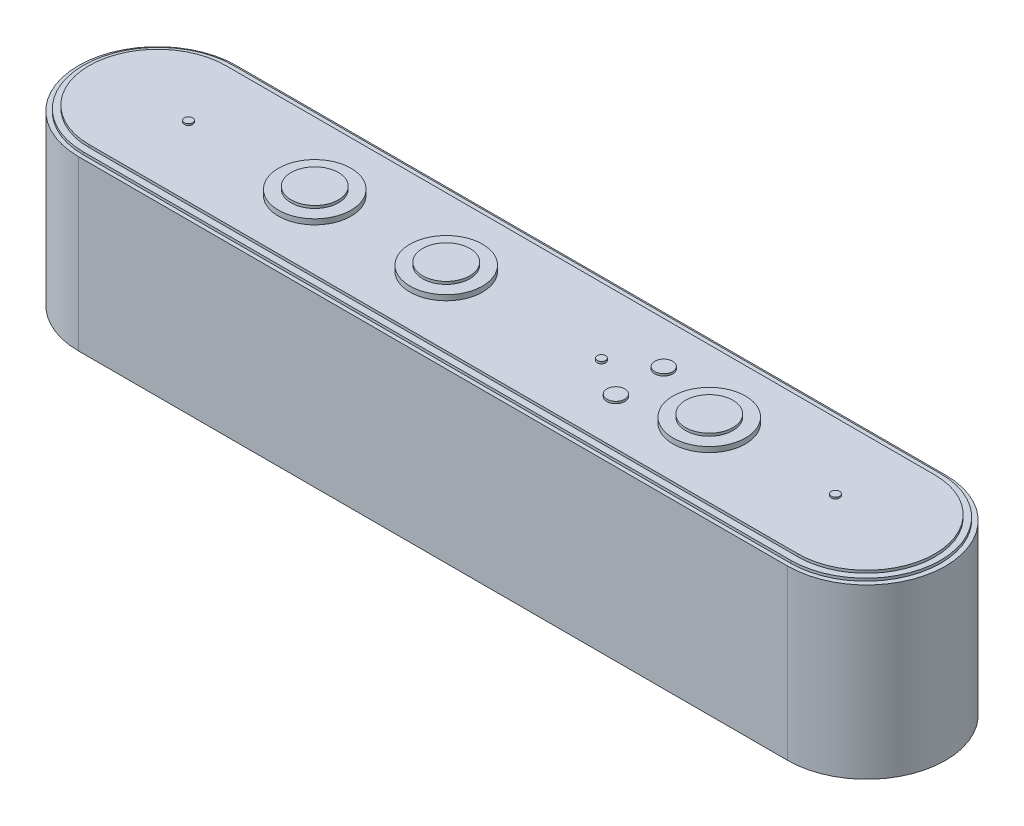
ISO-10303-21;
HEADER;
FILE_DESCRIPTION(('STEP AP214'),'2;1');
FILE_NAME('part.step','',(''),(''),'','','');
FILE_SCHEMA(('AUTOMOTIVE_DESIGN { 1 0 10303 214 1 1 1 1 }'));
ENDSEC;
DATA;
#1=APPLICATION_CONTEXT('core data for automotive mechanical design processes');
#2=APPLICATION_PROTOCOL_DEFINITION('international standard','automotive_design',2000,#1);
#3=PRODUCT_CONTEXT('',#1,'mechanical');
#4=PRODUCT('Part','Part','',(#3));
#5=PRODUCT_RELATED_PRODUCT_CATEGORY('part','',(#4));
#6=PRODUCT_DEFINITION_FORMATION('','',#4);
#7=PRODUCT_DEFINITION_CONTEXT('part definition',#1,'design');
#8=PRODUCT_DEFINITION('design','',#6,#7);
#9=PRODUCT_DEFINITION_SHAPE('','',#8);
#10=(LENGTH_UNIT() NAMED_UNIT(*) SI_UNIT(.MILLI.,.METRE.));
#11=(NAMED_UNIT(*) PLANE_ANGLE_UNIT() SI_UNIT($,.RADIAN.));
#12=(NAMED_UNIT(*) SI_UNIT($,.STERADIAN.) SOLID_ANGLE_UNIT());
#13=UNCERTAINTY_MEASURE_WITH_UNIT(LENGTH_MEASURE(1.E-05),#10,'distance_accuracy_value','');
#14=(GEOMETRIC_REPRESENTATION_CONTEXT(3) GLOBAL_UNCERTAINTY_ASSIGNED_CONTEXT((#13)) GLOBAL_UNIT_ASSIGNED_CONTEXT((#10,
#11,#12)) REPRESENTATION_CONTEXT('',''));
#15=CARTESIAN_POINT('',(0.,0.,0.));
#16=DIRECTION('',(0.,0.,1.));
#17=DIRECTION('',(1.,0.,0.));
#18=AXIS2_PLACEMENT_3D('',#15,#16,#17);
#19=CARTESIAN_POINT('',(0.,14.7,15.));
#20=DIRECTION('',(0.,-1.,0.));
#21=DIRECTION('',(-1.,0.,0.));
#22=AXIS2_PLACEMENT_3D('',#19,#20,#21);
#23=PLANE('',#22);
#24=CARTESIAN_POINT('',(67.425,14.7,15.));
#25=DIRECTION('',(0.,-1.,0.));
#26=DIRECTION('',(0.,0.,-1.));
#27=AXIS2_PLACEMENT_3D('',#24,#25,#26);
#28=CIRCLE('',#27,15.);
#29=CARTESIAN_POINT('',(67.425,14.7,0.));
#30=VERTEX_POINT('',#29);
#31=CARTESIAN_POINT('',(67.425,14.7,30.));
#32=VERTEX_POINT('',#31);
#33=EDGE_CURVE('P0_E25',#30,#32,#28,.T.);
#34=ORIENTED_EDGE('',*,*,#33,.F.);
#35=DIRECTION('',(1.,0.,0.));
#36=VECTOR('',#35,1.);
#37=CARTESIAN_POINT('',(-67.425,14.7,0.));
#38=LINE('',#37,#36);
#39=CARTESIAN_POINT('',(-67.425,14.7,0.));
#40=VERTEX_POINT('',#39);
#41=EDGE_CURVE('P0_E64',#40,#30,#38,.T.);
#42=ORIENTED_EDGE('',*,*,#41,.F.);
#43=CARTESIAN_POINT('',(-67.425,14.7,15.));
#44=DIRECTION('',(0.,-1.,0.));
#45=DIRECTION('',(0.,0.,1.));
#46=AXIS2_PLACEMENT_3D('',#43,#44,#45);
#47=CIRCLE('',#46,15.);
#48=CARTESIAN_POINT('',(-67.425,14.7,30.));
#49=VERTEX_POINT('',#48);
#50=EDGE_CURVE('P0_E67',#49,#40,#47,.T.);
#51=ORIENTED_EDGE('',*,*,#50,.F.);
#52=DIRECTION('',(-1.,0.,0.));
#53=VECTOR('',#52,1.);
#54=CARTESIAN_POINT('',(67.425,14.7,30.));
#55=LINE('',#54,#53);
#56=EDGE_CURVE('P0_E106',#32,#49,#55,.T.);
#57=ORIENTED_EDGE('',*,*,#56,.F.);
#58=EDGE_LOOP('',(#34,#42,#51,#57));
#59=FACE_BOUND('',#58,.T.);
#60=ADVANCED_FACE('P0_F17',(#59),#23,.F.);
#61=CARTESIAN_POINT('',(0.,-17.3,15.));
#62=DIRECTION('',(0.,-1.,0.));
#63=DIRECTION('',(-1.,0.,0.));
#64=AXIS2_PLACEMENT_3D('',#61,#62,#63);
#65=PLANE('',#64);
#66=DIRECTION('',(-1.,0.,0.));
#67=VECTOR('',#66,1.);
#68=CARTESIAN_POINT('',(67.425,-17.3,30.));
#69=LINE('',#68,#67);
#70=CARTESIAN_POINT('',(67.425,-17.3,30.));
#71=VERTEX_POINT('',#70);
#72=CARTESIAN_POINT('',(-67.425,-17.3,30.));
#73=VERTEX_POINT('',#72);
#74=EDGE_CURVE('P0_E88',#71,#73,#69,.T.);
#75=ORIENTED_EDGE('',*,*,#74,.T.);
#76=CARTESIAN_POINT('',(-67.425,-17.3,15.));
#77=DIRECTION('',(0.,-1.,0.));
#78=DIRECTION('',(0.,0.,1.));
#79=AXIS2_PLACEMENT_3D('',#76,#77,#78);
#80=CIRCLE('',#79,15.);
#81=CARTESIAN_POINT('',(-67.425,-17.3,0.));
#82=VERTEX_POINT('',#81);
#83=EDGE_CURVE('P0_E73',#73,#82,#80,.T.);
#84=ORIENTED_EDGE('',*,*,#83,.T.);
#85=DIRECTION('',(1.,0.,0.));
#86=VECTOR('',#85,1.);
#87=CARTESIAN_POINT('',(-67.425,-17.3,0.));
#88=LINE('',#87,#86);
#89=CARTESIAN_POINT('',(67.425,-17.3,0.));
#90=VERTEX_POINT('',#89);
#91=EDGE_CURVE('P0_E78',#82,#90,#88,.T.);
#92=ORIENTED_EDGE('',*,*,#91,.T.);
#93=CARTESIAN_POINT('',(67.425,-17.3,15.));
#94=DIRECTION('',(0.,-1.,0.));
#95=DIRECTION('',(0.,0.,-1.));
#96=AXIS2_PLACEMENT_3D('',#93,#94,#95);
#97=CIRCLE('',#96,15.);
#98=EDGE_CURVE('P0_E11',#90,#71,#97,.T.);
#99=ORIENTED_EDGE('',*,*,#98,.T.);
#100=EDGE_LOOP('',(#75,#84,#92,#99));
#101=FACE_BOUND('',#100,.T.);
#102=ADVANCED_FACE('P0_F125',(#101),#65,.T.);
#103=CARTESIAN_POINT('',(67.425,-17.3,15.));
#104=DIRECTION('',(0.,-1.,0.));
#105=DIRECTION('',(0.,0.,-1.));
#106=AXIS2_PLACEMENT_3D('',#103,#104,#105);
#107=CYLINDRICAL_SURFACE('',#106,15.);
#108=DIRECTION('',(0.,1.,0.));
#109=VECTOR('',#108,1.);
#110=CARTESIAN_POINT('',(67.425,-17.3,0.));
#111=LINE('',#110,#109);
#112=EDGE_CURVE('P0_E72',#90,#30,#111,.T.);
#113=ORIENTED_EDGE('',*,*,#112,.T.);
#114=ORIENTED_EDGE('',*,*,#33,.T.);
#115=DIRECTION('',(0.,1.,0.));
#116=VECTOR('',#115,1.);
#117=CARTESIAN_POINT('',(67.425,-17.3,30.));
#118=LINE('',#117,#116);
#119=EDGE_CURVE('P0_E105',#71,#32,#118,.T.);
#120=ORIENTED_EDGE('',*,*,#119,.F.);
#121=ORIENTED_EDGE('',*,*,#98,.F.);
#122=EDGE_LOOP('',(#113,#114,#120,#121));
#123=FACE_BOUND('',#122,.T.);
#124=ADVANCED_FACE('P0_F102',(#123),#107,.T.);
#125=CARTESIAN_POINT('',(-67.425,-17.3,0.));
#126=DIRECTION('',(0.,0.,-1.));
#127=DIRECTION('',(0.,-1.,0.));
#128=AXIS2_PLACEMENT_3D('',#125,#126,#127);
#129=PLANE('',#128);
#130=DIRECTION('',(0.,1.,0.));
#131=VECTOR('',#130,1.);
#132=CARTESIAN_POINT('',(-67.425,-17.3,0.));
#133=LINE('',#132,#131);
#134=EDGE_CURVE('P0_E76',#82,#40,#133,.T.);
#135=ORIENTED_EDGE('',*,*,#134,.T.);
#136=ORIENTED_EDGE('',*,*,#41,.T.);
#137=ORIENTED_EDGE('',*,*,#112,.F.);
#138=ORIENTED_EDGE('',*,*,#91,.F.);
#139=EDGE_LOOP('',(#135,#136,#137,#138));
#140=FACE_BOUND('',#139,.T.);
#141=ADVANCED_FACE('P0_F77',(#140),#129,.T.);
#142=CARTESIAN_POINT('',(-67.425,-17.3,15.));
#143=DIRECTION('',(0.,-1.,0.));
#144=DIRECTION('',(0.,0.,1.));
#145=AXIS2_PLACEMENT_3D('',#142,#143,#144);
#146=CYLINDRICAL_SURFACE('',#145,15.);
#147=DIRECTION('',(0.,1.,0.));
#148=VECTOR('',#147,1.);
#149=CARTESIAN_POINT('',(-67.425,-17.3,30.));
#150=LINE('',#149,#148);
#151=EDGE_CURVE('P0_E85',#73,#49,#150,.T.);
#152=ORIENTED_EDGE('',*,*,#151,.T.);
#153=ORIENTED_EDGE('',*,*,#50,.T.);
#154=ORIENTED_EDGE('',*,*,#134,.F.);
#155=ORIENTED_EDGE('',*,*,#83,.F.);
#156=EDGE_LOOP('',(#152,#153,#154,#155));
#157=FACE_BOUND('',#156,.T.);
#158=ADVANCED_FACE('P0_F83',(#157),#146,.T.);
#159=CARTESIAN_POINT('',(67.425,-17.3,30.));
#160=DIRECTION('',(0.,0.,1.));
#161=DIRECTION('',(1.,0.,0.));
#162=AXIS2_PLACEMENT_3D('',#159,#160,#161);
#163=PLANE('',#162);
#164=ORIENTED_EDGE('',*,*,#119,.T.);
#165=ORIENTED_EDGE('',*,*,#56,.T.);
#166=ORIENTED_EDGE('',*,*,#151,.F.);
#167=ORIENTED_EDGE('',*,*,#74,.F.);
#168=EDGE_LOOP('',(#164,#165,#166,#167));
#169=FACE_BOUND('',#168,.T.);
#170=ADVANCED_FACE('P0_F111',(#169),#163,.T.);
#171=CLOSED_SHELL('',(#60,#102,#124,#141,#158,#170));
#172=MANIFOLD_SOLID_BREP('P0_B1',#171);
#173=CARTESIAN_POINT('',(61.5,15.85,15.));
#174=DIRECTION('',(0.,1.,0.));
#175=DIRECTION('',(1.,0.,0.));
#176=AXIS2_PLACEMENT_3D('',#173,#174,#175);
#177=PLANE('',#176);
#178=CARTESIAN_POINT('',(61.5,15.85,15.));
#179=DIRECTION('',(0.,1.,0.));
#180=DIRECTION('',(0.,0.,-1.));
#181=AXIS2_PLACEMENT_3D('',#178,#179,#180);
#182=CIRCLE('',#181,0.8);
#183=CARTESIAN_POINT('',(61.5,15.85,14.2));
#184=VERTEX_POINT('',#183);
#185=EDGE_CURVE('P1_E11',#184,#184,#182,.T.);
#186=ORIENTED_EDGE('',*,*,#185,.F.);
#187=EDGE_LOOP('',(#186));
#188=FACE_BOUND('',#187,.T.);
#189=ADVANCED_FACE('P1_F17',(#188),#177,.F.);
#190=CARTESIAN_POINT('',(61.5,16.15,15.));
#191=DIRECTION('',(0.,1.,0.));
#192=DIRECTION('',(1.,0.,0.));
#193=AXIS2_PLACEMENT_3D('',#190,#191,#192);
#194=PLANE('',#193);
#195=CARTESIAN_POINT('',(61.5,16.15,15.));
#196=DIRECTION('',(0.,1.,0.));
#197=DIRECTION('',(0.,0.,-1.));
#198=AXIS2_PLACEMENT_3D('',#195,#196,#197);
#199=CIRCLE('',#198,0.8);
#200=CARTESIAN_POINT('',(61.5,16.15,14.2));
#201=VERTEX_POINT('',#200);
#202=EDGE_CURVE('P1_E41',#201,#201,#199,.T.);
#203=ORIENTED_EDGE('',*,*,#202,.T.);
#204=EDGE_LOOP('',(#203));
#205=FACE_BOUND('',#204,.T.);
#206=ADVANCED_FACE('P1_F44',(#205),#194,.T.);
#207=CARTESIAN_POINT('',(61.5,15.85,15.));
#208=DIRECTION('',(0.,1.,0.));
#209=DIRECTION('',(0.,0.,-1.));
#210=AXIS2_PLACEMENT_3D('',#207,#208,#209);
#211=CYLINDRICAL_SURFACE('',#210,0.8);
#212=ORIENTED_EDGE('',*,*,#202,.F.);
#213=DIRECTION('',(0.,1.,0.));
#214=VECTOR('',#213,1.);
#215=CARTESIAN_POINT('',(61.5,15.85,14.2));
#216=LINE('',#215,#214);
#217=EDGE_CURVE('P1_E25',#184,#201,#216,.T.);
#218=ORIENTED_EDGE('',*,*,#217,.F.);
#219=ORIENTED_EDGE('',*,*,#185,.T.);
#220=ORIENTED_EDGE('',*,*,#217,.T.);
#221=EDGE_LOOP('',(#212,#218,#219,#220));
#222=FACE_BOUND('',#221,.T.);
#223=ADVANCED_FACE('P1_F40',(#222),#211,.T.);
#224=CLOSED_SHELL('',(#189,#206,#223));
#225=MANIFOLD_SOLID_BREP('P1_B1',#224);
#226=CARTESIAN_POINT('',(-61.5,15.85,15.));
#227=DIRECTION('',(0.,1.,0.));
#228=DIRECTION('',(1.,0.,0.));
#229=AXIS2_PLACEMENT_3D('',#226,#227,#228);
#230=PLANE('',#229);
#231=CARTESIAN_POINT('',(-61.5,15.85,15.));
#232=DIRECTION('',(0.,1.,0.));
#233=DIRECTION('',(0.,0.,-1.));
#234=AXIS2_PLACEMENT_3D('',#231,#232,#233);
#235=CIRCLE('',#234,0.8);
#236=CARTESIAN_POINT('',(-61.5,15.85,14.2));
#237=VERTEX_POINT('',#236);
#238=EDGE_CURVE('P2_E11',#237,#237,#235,.T.);
#239=ORIENTED_EDGE('',*,*,#238,.F.);
#240=EDGE_LOOP('',(#239));
#241=FACE_BOUND('',#240,.T.);
#242=ADVANCED_FACE('P2_F17',(#241),#230,.F.);
#243=CARTESIAN_POINT('',(-61.5,16.15,15.));
#244=DIRECTION('',(0.,1.,0.));
#245=DIRECTION('',(1.,0.,0.));
#246=AXIS2_PLACEMENT_3D('',#243,#244,#245);
#247=PLANE('',#246);
#248=CARTESIAN_POINT('',(-61.5,16.15,15.));
#249=DIRECTION('',(0.,1.,0.));
#250=DIRECTION('',(0.,0.,-1.));
#251=AXIS2_PLACEMENT_3D('',#248,#249,#250);
#252=CIRCLE('',#251,0.8);
#253=CARTESIAN_POINT('',(-61.5,16.15,14.2));
#254=VERTEX_POINT('',#253);
#255=EDGE_CURVE('P2_E41',#254,#254,#252,.T.);
#256=ORIENTED_EDGE('',*,*,#255,.T.);
#257=EDGE_LOOP('',(#256));
#258=FACE_BOUND('',#257,.T.);
#259=ADVANCED_FACE('P2_F44',(#258),#247,.T.);
#260=CARTESIAN_POINT('',(-61.5,15.85,15.));
#261=DIRECTION('',(0.,1.,0.));
#262=DIRECTION('',(0.,0.,-1.));
#263=AXIS2_PLACEMENT_3D('',#260,#261,#262);
#264=CYLINDRICAL_SURFACE('',#263,0.8);
#265=ORIENTED_EDGE('',*,*,#255,.F.);
#266=DIRECTION('',(0.,1.,0.));
#267=VECTOR('',#266,1.);
#268=CARTESIAN_POINT('',(-61.5,15.85,14.2));
#269=LINE('',#268,#267);
#270=EDGE_CURVE('P2_E25',#237,#254,#269,.T.);
#271=ORIENTED_EDGE('',*,*,#270,.F.);
#272=ORIENTED_EDGE('',*,*,#238,.T.);
#273=ORIENTED_EDGE('',*,*,#270,.T.);
#274=EDGE_LOOP('',(#265,#271,#272,#273));
#275=FACE_BOUND('',#274,.T.);
#276=ADVANCED_FACE('P2_F40',(#275),#264,.T.);
#277=CLOSED_SHELL('',(#242,#259,#276));
#278=MANIFOLD_SOLID_BREP('P2_B1',#277);
#279=CARTESIAN_POINT('',(24.3,15.85,10.45));
#280=DIRECTION('',(0.,1.,0.));
#281=DIRECTION('',(1.,0.,0.));
#282=AXIS2_PLACEMENT_3D('',#279,#280,#281);
#283=PLANE('',#282);
#284=CARTESIAN_POINT('',(24.3,15.85,10.45));
#285=DIRECTION('',(0.,1.,0.));
#286=DIRECTION('',(0.,0.,-1.));
#287=AXIS2_PLACEMENT_3D('',#284,#285,#286);
#288=CIRCLE('',#287,1.7);
#289=CARTESIAN_POINT('',(24.3,15.85,8.75));
#290=VERTEX_POINT('',#289);
#291=EDGE_CURVE('P3_E11',#290,#290,#288,.T.);
#292=ORIENTED_EDGE('',*,*,#291,.F.);
#293=EDGE_LOOP('',(#292));
#294=FACE_BOUND('',#293,.T.);
#295=ADVANCED_FACE('P3_F17',(#294),#283,.F.);
#296=CARTESIAN_POINT('',(24.3,16.25,10.45));
#297=DIRECTION('',(0.,1.,0.));
#298=DIRECTION('',(1.,0.,0.));
#299=AXIS2_PLACEMENT_3D('',#296,#297,#298);
#300=PLANE('',#299);
#301=CARTESIAN_POINT('',(24.3,16.25,10.45));
#302=DIRECTION('',(0.,1.,0.));
#303=DIRECTION('',(0.,0.,-1.));
#304=AXIS2_PLACEMENT_3D('',#301,#302,#303);
#305=CIRCLE('',#304,1.7);
#306=CARTESIAN_POINT('',(24.3,16.25,8.75));
#307=VERTEX_POINT('',#306);
#308=EDGE_CURVE('P3_E41',#307,#307,#305,.T.);
#309=ORIENTED_EDGE('',*,*,#308,.T.);
#310=EDGE_LOOP('',(#309));
#311=FACE_BOUND('',#310,.T.);
#312=ADVANCED_FACE('P3_F44',(#311),#300,.T.);
#313=CARTESIAN_POINT('',(24.3,15.85,10.45));
#314=DIRECTION('',(0.,1.,0.));
#315=DIRECTION('',(0.,0.,-1.));
#316=AXIS2_PLACEMENT_3D('',#313,#314,#315);
#317=CYLINDRICAL_SURFACE('',#316,1.7);
#318=ORIENTED_EDGE('',*,*,#308,.F.);
#319=DIRECTION('',(0.,1.,0.));
#320=VECTOR('',#319,1.);
#321=CARTESIAN_POINT('',(24.3,15.85,8.75));
#322=LINE('',#321,#320);
#323=EDGE_CURVE('P3_E20',#290,#307,#322,.T.);
#324=ORIENTED_EDGE('',*,*,#323,.F.);
#325=ORIENTED_EDGE('',*,*,#291,.T.);
#326=ORIENTED_EDGE('',*,*,#323,.T.);
#327=EDGE_LOOP('',(#318,#324,#325,#326));
#328=FACE_BOUND('',#327,.T.);
#329=ADVANCED_FACE('P3_F40',(#328),#317,.T.);
#330=CLOSED_SHELL('',(#295,#312,#329));
#331=MANIFOLD_SOLID_BREP('P3_B1',#330);
#332=CARTESIAN_POINT('',(24.3,15.85,19.55));
#333=DIRECTION('',(0.,1.,0.));
#334=DIRECTION('',(1.,0.,0.));
#335=AXIS2_PLACEMENT_3D('',#332,#333,#334);
#336=PLANE('',#335);
#337=CARTESIAN_POINT('',(24.3,15.85,19.55));
#338=DIRECTION('',(0.,1.,0.));
#339=DIRECTION('',(0.,0.,-1.));
#340=AXIS2_PLACEMENT_3D('',#337,#338,#339);
#341=CIRCLE('',#340,1.7);
#342=CARTESIAN_POINT('',(24.3,15.85,17.85));
#343=VERTEX_POINT('',#342);
#344=EDGE_CURVE('P4_E11',#343,#343,#341,.T.);
#345=ORIENTED_EDGE('',*,*,#344,.F.);
#346=EDGE_LOOP('',(#345));
#347=FACE_BOUND('',#346,.T.);
#348=ADVANCED_FACE('P4_F17',(#347),#336,.F.);
#349=CARTESIAN_POINT('',(24.3,16.25,19.55));
#350=DIRECTION('',(0.,1.,0.));
#351=DIRECTION('',(1.,0.,0.));
#352=AXIS2_PLACEMENT_3D('',#349,#350,#351);
#353=PLANE('',#352);
#354=CARTESIAN_POINT('',(24.3,16.25,19.55));
#355=DIRECTION('',(0.,1.,0.));
#356=DIRECTION('',(0.,0.,-1.));
#357=AXIS2_PLACEMENT_3D('',#354,#355,#356);
#358=CIRCLE('',#357,1.7);
#359=CARTESIAN_POINT('',(24.3,16.25,17.85));
#360=VERTEX_POINT('',#359);
#361=EDGE_CURVE('P4_E41',#360,#360,#358,.T.);
#362=ORIENTED_EDGE('',*,*,#361,.T.);
#363=EDGE_LOOP('',(#362));
#364=FACE_BOUND('',#363,.T.);
#365=ADVANCED_FACE('P4_F44',(#364),#353,.T.);
#366=CARTESIAN_POINT('',(24.3,15.85,19.55));
#367=DIRECTION('',(0.,1.,0.));
#368=DIRECTION('',(0.,0.,-1.));
#369=AXIS2_PLACEMENT_3D('',#366,#367,#368);
#370=CYLINDRICAL_SURFACE('',#369,1.7);
#371=ORIENTED_EDGE('',*,*,#361,.F.);
#372=DIRECTION('',(0.,1.,0.));
#373=VECTOR('',#372,1.);
#374=CARTESIAN_POINT('',(24.3,15.85,17.85));
#375=LINE('',#374,#373);
#376=EDGE_CURVE('P4_E25',#343,#360,#375,.T.);
#377=ORIENTED_EDGE('',*,*,#376,.F.);
#378=ORIENTED_EDGE('',*,*,#344,.T.);
#379=ORIENTED_EDGE('',*,*,#376,.T.);
#380=EDGE_LOOP('',(#371,#377,#378,#379));
#381=FACE_BOUND('',#380,.T.);
#382=ADVANCED_FACE('P4_F40',(#381),#370,.T.);
#383=CLOSED_SHELL('',(#348,#365,#382));
#384=MANIFOLD_SOLID_BREP('P4_B1',#383);
#385=CARTESIAN_POINT('',(17.,15.85,15.));
#386=DIRECTION('',(0.,1.,0.));
#387=DIRECTION('',(1.,0.,0.));
#388=AXIS2_PLACEMENT_3D('',#385,#386,#387);
#389=PLANE('',#388);
#390=CARTESIAN_POINT('',(17.,15.85,15.));
#391=DIRECTION('',(0.,1.,0.));
#392=DIRECTION('',(0.,0.,-1.));
#393=AXIS2_PLACEMENT_3D('',#390,#391,#392);
#394=CIRCLE('',#393,0.8);
#395=CARTESIAN_POINT('',(17.,15.85,14.2));
#396=VERTEX_POINT('',#395);
#397=EDGE_CURVE('P5_E10',#396,#396,#394,.T.);
#398=ORIENTED_EDGE('',*,*,#397,.F.);
#399=EDGE_LOOP('',(#398));
#400=FACE_BOUND('',#399,.T.);
#401=ADVANCED_FACE('P5_F16',(#400),#389,.F.);
#402=CARTESIAN_POINT('',(17.,16.25,15.));
#403=DIRECTION('',(0.,1.,0.));
#404=DIRECTION('',(1.,0.,0.));
#405=AXIS2_PLACEMENT_3D('',#402,#403,#404);
#406=PLANE('',#405);
#407=CARTESIAN_POINT('',(17.,16.25,15.));
#408=DIRECTION('',(0.,1.,0.));
#409=DIRECTION('',(0.,0.,-1.));
#410=AXIS2_PLACEMENT_3D('',#407,#408,#409);
#411=CIRCLE('',#410,0.8);
#412=CARTESIAN_POINT('',(17.,16.25,14.2));
#413=VERTEX_POINT('',#412);
#414=EDGE_CURVE('P5_E40',#413,#413,#411,.T.);
#415=ORIENTED_EDGE('',*,*,#414,.T.);
#416=EDGE_LOOP('',(#415));
#417=FACE_BOUND('',#416,.T.);
#418=ADVANCED_FACE('P5_F43',(#417),#406,.T.);
#419=CARTESIAN_POINT('',(17.,15.85,15.));
#420=DIRECTION('',(0.,1.,0.));
#421=DIRECTION('',(0.,0.,-1.));
#422=AXIS2_PLACEMENT_3D('',#419,#420,#421);
#423=CYLINDRICAL_SURFACE('',#422,0.8);
#424=ORIENTED_EDGE('',*,*,#414,.F.);
#425=DIRECTION('',(0.,1.,0.));
#426=VECTOR('',#425,1.);
#427=CARTESIAN_POINT('',(17.,15.85,14.2));
#428=LINE('',#427,#426);
#429=EDGE_CURVE('P5_E19',#396,#413,#428,.T.);
#430=ORIENTED_EDGE('',*,*,#429,.F.);
#431=ORIENTED_EDGE('',*,*,#397,.T.);
#432=ORIENTED_EDGE('',*,*,#429,.T.);
#433=EDGE_LOOP('',(#424,#430,#431,#432));
#434=FACE_BOUND('',#433,.T.);
#435=ADVANCED_FACE('P5_F39',(#434),#423,.T.);
#436=CLOSED_SHELL('',(#401,#418,#435));
#437=MANIFOLD_SOLID_BREP('P5_B1',#436);
#438=CARTESIAN_POINT('',(0.,15.7,15.));
#439=DIRECTION('',(0.,-1.,0.));
#440=DIRECTION('',(-1.,0.,0.));
#441=AXIS2_PLACEMENT_3D('',#438,#439,#440);
#442=PLANE('',#441);
#443=CARTESIAN_POINT('',(67.4,15.7,15.));
#444=DIRECTION('',(0.,-1.,0.));
#445=DIRECTION('',(0.,0.,-1.));
#446=AXIS2_PLACEMENT_3D('',#443,#444,#445);
#447=CIRCLE('',#446,13.);
#448=CARTESIAN_POINT('',(67.4,15.7,2.));
#449=VERTEX_POINT('',#448);
#450=CARTESIAN_POINT('',(67.4,15.7,28.));
#451=VERTEX_POINT('',#450);
#452=EDGE_CURVE('P6_E26',#449,#451,#447,.T.);
#453=ORIENTED_EDGE('',*,*,#452,.F.);
#454=DIRECTION('',(1.,0.,0.));
#455=VECTOR('',#454,1.);
#456=CARTESIAN_POINT('',(-67.4,15.7,2.));
#457=LINE('',#456,#455);
#458=CARTESIAN_POINT('',(-67.4,15.7,2.));
#459=VERTEX_POINT('',#458);
#460=EDGE_CURVE('P6_E107',#459,#449,#457,.T.);
#461=ORIENTED_EDGE('',*,*,#460,.F.);
#462=CARTESIAN_POINT('',(-67.4,15.7,15.));
#463=DIRECTION('',(0.,-1.,0.));
#464=DIRECTION('',(0.,0.,1.));
#465=AXIS2_PLACEMENT_3D('',#462,#463,#464);
#466=CIRCLE('',#465,13.);
#467=CARTESIAN_POINT('',(-67.4,15.7,28.));
#468=VERTEX_POINT('',#467);
#469=EDGE_CURVE('P6_E83',#468,#459,#466,.T.);
#470=ORIENTED_EDGE('',*,*,#469,.F.);
#471=DIRECTION('',(-1.,0.,0.));
#472=VECTOR('',#471,1.);
#473=CARTESIAN_POINT('',(67.4,15.7,28.));
#474=LINE('',#473,#472);
#475=EDGE_CURVE('P6_E87',#451,#468,#474,.T.);
#476=ORIENTED_EDGE('',*,*,#475,.F.);
#477=EDGE_LOOP('',(#453,#461,#470,#476));
#478=FACE_BOUND('',#477,.T.);
#479=ADVANCED_FACE('P6_F17',(#478),#442,.F.);
#480=CARTESIAN_POINT('',(0.,14.7,15.));
#481=DIRECTION('',(0.,-1.,0.));
#482=DIRECTION('',(-1.,0.,0.));
#483=AXIS2_PLACEMENT_3D('',#480,#481,#482);
#484=PLANE('',#483);
#485=DIRECTION('',(-1.,0.,0.));
#486=VECTOR('',#485,1.);
#487=CARTESIAN_POINT('',(67.4,14.7,28.));
#488=LINE('',#487,#486);
#489=CARTESIAN_POINT('',(67.4,14.7,28.));
#490=VERTEX_POINT('',#489);
#491=CARTESIAN_POINT('',(-67.4,14.7,28.));
#492=VERTEX_POINT('',#491);
#493=EDGE_CURVE('P6_E72',#490,#492,#488,.T.);
#494=ORIENTED_EDGE('',*,*,#493,.T.);
#495=CARTESIAN_POINT('',(-67.4,14.7,15.));
#496=DIRECTION('',(0.,-1.,0.));
#497=DIRECTION('',(0.,0.,1.));
#498=AXIS2_PLACEMENT_3D('',#495,#496,#497);
#499=CIRCLE('',#498,13.);
#500=CARTESIAN_POINT('',(-67.4,14.7,2.));
#501=VERTEX_POINT('',#500);
#502=EDGE_CURVE('P6_E99',#492,#501,#499,.T.);
#503=ORIENTED_EDGE('',*,*,#502,.T.);
#504=DIRECTION('',(1.,0.,0.));
#505=VECTOR('',#504,1.);
#506=CARTESIAN_POINT('',(-67.4,14.7,2.));
#507=LINE('',#506,#505);
#508=CARTESIAN_POINT('',(67.4,14.7,2.));
#509=VERTEX_POINT('',#508);
#510=EDGE_CURVE('P6_E20',#501,#509,#507,.T.);
#511=ORIENTED_EDGE('',*,*,#510,.T.);
#512=CARTESIAN_POINT('',(67.4,14.7,15.));
#513=DIRECTION('',(0.,-1.,0.));
#514=DIRECTION('',(0.,0.,-1.));
#515=AXIS2_PLACEMENT_3D('',#512,#513,#514);
#516=CIRCLE('',#515,13.);
#517=EDGE_CURVE('P6_E11',#509,#490,#516,.T.);
#518=ORIENTED_EDGE('',*,*,#517,.T.);
#519=EDGE_LOOP('',(#494,#503,#511,#518));
#520=FACE_BOUND('',#519,.T.);
#521=ADVANCED_FACE('P6_F70',(#520),#484,.T.);
#522=CARTESIAN_POINT('',(67.4,14.7,15.));
#523=DIRECTION('',(0.,-1.,0.));
#524=DIRECTION('',(0.,0.,-1.));
#525=AXIS2_PLACEMENT_3D('',#522,#523,#524);
#526=CYLINDRICAL_SURFACE('',#525,13.);
#527=DIRECTION('',(0.,1.,0.));
#528=VECTOR('',#527,1.);
#529=CARTESIAN_POINT('',(67.4,14.7,2.));
#530=LINE('',#529,#528);
#531=EDGE_CURVE('P6_E111',#509,#449,#530,.T.);
#532=ORIENTED_EDGE('',*,*,#531,.T.);
#533=ORIENTED_EDGE('',*,*,#452,.T.);
#534=DIRECTION('',(0.,1.,0.));
#535=VECTOR('',#534,1.);
#536=CARTESIAN_POINT('',(67.4,14.7,28.));
#537=LINE('',#536,#535);
#538=EDGE_CURVE('P6_E79',#490,#451,#537,.T.);
#539=ORIENTED_EDGE('',*,*,#538,.F.);
#540=ORIENTED_EDGE('',*,*,#517,.F.);
#541=EDGE_LOOP('',(#532,#533,#539,#540));
#542=FACE_BOUND('',#541,.T.);
#543=ADVANCED_FACE('P6_F85',(#542),#526,.T.);
#544=CARTESIAN_POINT('',(-67.4,14.7,2.));
#545=DIRECTION('',(0.,0.,-1.));
#546=DIRECTION('',(0.,-1.,0.));
#547=AXIS2_PLACEMENT_3D('',#544,#545,#546);
#548=PLANE('',#547);
#549=DIRECTION('',(0.,1.,0.));
#550=VECTOR('',#549,1.);
#551=CARTESIAN_POINT('',(-67.4,14.7,2.));
#552=LINE('',#551,#550);
#553=EDGE_CURVE('P6_E95',#501,#459,#552,.T.);
#554=ORIENTED_EDGE('',*,*,#553,.T.);
#555=ORIENTED_EDGE('',*,*,#460,.T.);
#556=ORIENTED_EDGE('',*,*,#531,.F.);
#557=ORIENTED_EDGE('',*,*,#510,.F.);
#558=EDGE_LOOP('',(#554,#555,#556,#557));
#559=FACE_BOUND('',#558,.T.);
#560=ADVANCED_FACE('P6_F133',(#559),#548,.T.);
#561=CARTESIAN_POINT('',(-67.4,14.7,15.));
#562=DIRECTION('',(0.,-1.,0.));
#563=DIRECTION('',(0.,0.,1.));
#564=AXIS2_PLACEMENT_3D('',#561,#562,#563);
#565=CYLINDRICAL_SURFACE('',#564,13.);
#566=DIRECTION('',(0.,1.,0.));
#567=VECTOR('',#566,1.);
#568=CARTESIAN_POINT('',(-67.4,14.7,28.));
#569=LINE('',#568,#567);
#570=EDGE_CURVE('P6_E81',#492,#468,#569,.T.);
#571=ORIENTED_EDGE('',*,*,#570,.T.);
#572=ORIENTED_EDGE('',*,*,#469,.T.);
#573=ORIENTED_EDGE('',*,*,#553,.F.);
#574=ORIENTED_EDGE('',*,*,#502,.F.);
#575=EDGE_LOOP('',(#571,#572,#573,#574));
#576=FACE_BOUND('',#575,.T.);
#577=ADVANCED_FACE('P6_F124',(#576),#565,.T.);
#578=CARTESIAN_POINT('',(67.4,14.7,28.));
#579=DIRECTION('',(0.,0.,1.));
#580=DIRECTION('',(1.,0.,0.));
#581=AXIS2_PLACEMENT_3D('',#578,#579,#580);
#582=PLANE('',#581);
#583=ORIENTED_EDGE('',*,*,#538,.T.);
#584=ORIENTED_EDGE('',*,*,#475,.T.);
#585=ORIENTED_EDGE('',*,*,#570,.F.);
#586=ORIENTED_EDGE('',*,*,#493,.F.);
#587=EDGE_LOOP('',(#583,#584,#585,#586));
#588=FACE_BOUND('',#587,.T.);
#589=ADVANCED_FACE('P6_F77',(#588),#582,.T.);
#590=CLOSED_SHELL('',(#479,#521,#543,#560,#577,#589));
#591=MANIFOLD_SOLID_BREP('P6_B1',#590);
#592=CARTESIAN_POINT('',(67.4,14.2,15.));
#593=DIRECTION('',(0.,-1.,0.));
#594=DIRECTION('',(0.,0.,-1.));
#595=AXIS2_PLACEMENT_3D('',#592,#593,#594);
#596=CYLINDRICAL_SURFACE('',#595,12.5);
#597=DIRECTION('',(0.,1.,0.));
#598=VECTOR('',#597,1.);
#599=CARTESIAN_POINT('',(67.4,14.2,27.5));
#600=LINE('',#599,#598);
#601=CARTESIAN_POINT('',(67.4,14.7,27.5));
#602=VERTEX_POINT('',#601);
#603=CARTESIAN_POINT('',(67.4,15.2,27.5));
#604=VERTEX_POINT('',#603);
#605=EDGE_CURVE('P7_E39',#602,#604,#600,.T.);
#606=ORIENTED_EDGE('',*,*,#605,.T.);
#607=CARTESIAN_POINT('',(67.4,15.2,15.));
#608=DIRECTION('',(0.,-1.,0.));
#609=DIRECTION('',(0.,0.,-1.));
#610=AXIS2_PLACEMENT_3D('',#607,#608,#609);
#611=CIRCLE('',#610,12.5);
#612=CARTESIAN_POINT('',(67.4,15.2,2.5));
#613=VERTEX_POINT('',#612);
#614=EDGE_CURVE('P7_E160',#613,#604,#611,.T.);
#615=ORIENTED_EDGE('',*,*,#614,.F.);
#616=DIRECTION('',(0.,1.,0.));
#617=VECTOR('',#616,1.);
#618=CARTESIAN_POINT('',(67.4,14.2,2.5));
#619=LINE('',#618,#617);
#620=CARTESIAN_POINT('',(67.4,14.7,2.5));
#621=VERTEX_POINT('',#620);
#622=EDGE_CURVE('P7_E11',#621,#613,#619,.T.);
#623=ORIENTED_EDGE('',*,*,#622,.F.);
#624=CARTESIAN_POINT('',(67.4,14.7,15.));
#625=DIRECTION('',(0.,-1.,0.));
#626=DIRECTION('',(0.,0.,-1.));
#627=AXIS2_PLACEMENT_3D('',#624,#625,#626);
#628=CIRCLE('',#627,12.5);
#629=EDGE_CURVE('P7_E125',#621,#602,#628,.T.);
#630=ORIENTED_EDGE('',*,*,#629,.T.);
#631=EDGE_LOOP('',(#606,#615,#623,#630));
#632=FACE_BOUND('',#631,.T.);
#633=ADVANCED_FACE('P7_F17',(#632),#596,.F.);
#634=CARTESIAN_POINT('',(-67.4,14.2,2.5));
#635=DIRECTION('',(0.,0.,-1.));
#636=DIRECTION('',(0.,-1.,0.));
#637=AXIS2_PLACEMENT_3D('',#634,#635,#636);
#638=PLANE('',#637);
#639=ORIENTED_EDGE('',*,*,#622,.T.);
#640=DIRECTION('',(1.,0.,0.));
#641=VECTOR('',#640,1.);
#642=CARTESIAN_POINT('',(-33.7,15.2,2.5));
#643=LINE('',#642,#641);
#644=CARTESIAN_POINT('',(-67.4,15.2,2.5));
#645=VERTEX_POINT('',#644);
#646=EDGE_CURVE('P7_E177',#645,#613,#643,.T.);
#647=ORIENTED_EDGE('',*,*,#646,.F.);
#648=DIRECTION('',(0.,1.,0.));
#649=VECTOR('',#648,1.);
#650=CARTESIAN_POINT('',(-67.4,14.2,2.5));
#651=LINE('',#650,#649);
#652=CARTESIAN_POINT('',(-67.4,14.7,2.5));
#653=VERTEX_POINT('',#652);
#654=EDGE_CURVE('P7_E27',#653,#645,#651,.T.);
#655=ORIENTED_EDGE('',*,*,#654,.F.);
#656=DIRECTION('',(1.,0.,0.));
#657=VECTOR('',#656,1.);
#658=CARTESIAN_POINT('',(-33.7,14.7,2.5));
#659=LINE('',#658,#657);
#660=EDGE_CURVE('P7_E119',#653,#621,#659,.T.);
#661=ORIENTED_EDGE('',*,*,#660,.T.);
#662=EDGE_LOOP('',(#639,#647,#655,#661));
#663=FACE_BOUND('',#662,.T.);
#664=ADVANCED_FACE('P7_F19',(#663),#638,.F.);
#665=CARTESIAN_POINT('',(-67.4,14.2,15.));
#666=DIRECTION('',(0.,-1.,0.));
#667=DIRECTION('',(0.,0.,1.));
#668=AXIS2_PLACEMENT_3D('',#665,#666,#667);
#669=CYLINDRICAL_SURFACE('',#668,12.5);
#670=ORIENTED_EDGE('',*,*,#654,.T.);
#671=CARTESIAN_POINT('',(-67.4,15.2,15.));
#672=DIRECTION('',(0.,-1.,0.));
#673=DIRECTION('',(0.,0.,1.));
#674=AXIS2_PLACEMENT_3D('',#671,#672,#673);
#675=CIRCLE('',#674,12.5);
#676=CARTESIAN_POINT('',(-67.4,15.2,27.5));
#677=VERTEX_POINT('',#676);
#678=EDGE_CURVE('P7_E108',#677,#645,#675,.T.);
#679=ORIENTED_EDGE('',*,*,#678,.F.);
#680=DIRECTION('',(0.,1.,0.));
#681=VECTOR('',#680,1.);
#682=CARTESIAN_POINT('',(-67.4,14.2,27.5));
#683=LINE('',#682,#681);
#684=CARTESIAN_POINT('',(-67.4,14.7,27.5));
#685=VERTEX_POINT('',#684);
#686=EDGE_CURVE('P7_E70',#685,#677,#683,.T.);
#687=ORIENTED_EDGE('',*,*,#686,.F.);
#688=CARTESIAN_POINT('',(-67.4,14.7,15.));
#689=DIRECTION('',(0.,-1.,0.));
#690=DIRECTION('',(0.,0.,1.));
#691=AXIS2_PLACEMENT_3D('',#688,#689,#690);
#692=CIRCLE('',#691,12.5);
#693=EDGE_CURVE('P7_E105',#685,#653,#692,.T.);
#694=ORIENTED_EDGE('',*,*,#693,.T.);
#695=EDGE_LOOP('',(#670,#679,#687,#694));
#696=FACE_BOUND('',#695,.T.);
#697=ADVANCED_FACE('P7_F104',(#696),#669,.F.);
#698=CARTESIAN_POINT('',(67.4,14.2,27.5));
#699=DIRECTION('',(0.,0.,1.));
#700=DIRECTION('',(1.,0.,0.));
#701=AXIS2_PLACEMENT_3D('',#698,#699,#700);
#702=PLANE('',#701);
#703=ORIENTED_EDGE('',*,*,#686,.T.);
#704=DIRECTION('',(-1.,0.,0.));
#705=VECTOR('',#704,1.);
#706=CARTESIAN_POINT('',(33.7,15.2,27.5));
#707=LINE('',#706,#705);
#708=EDGE_CURVE('P7_E110',#604,#677,#707,.T.);
#709=ORIENTED_EDGE('',*,*,#708,.F.);
#710=ORIENTED_EDGE('',*,*,#605,.F.);
#711=DIRECTION('',(-1.,0.,0.));
#712=VECTOR('',#711,1.);
#713=CARTESIAN_POINT('',(33.7,14.7,27.5));
#714=LINE('',#713,#712);
#715=EDGE_CURVE('P7_E117',#602,#685,#714,.T.);
#716=ORIENTED_EDGE('',*,*,#715,.T.);
#717=EDGE_LOOP('',(#703,#709,#710,#716));
#718=FACE_BOUND('',#717,.T.);
#719=ADVANCED_FACE('P7_F123',(#718),#702,.F.);
#720=CARTESIAN_POINT('',(-67.25,14.7,0.75));
#721=DIRECTION('',(0.,0.,-1.));
#722=DIRECTION('',(0.,-1.,0.));
#723=AXIS2_PLACEMENT_3D('',#720,#721,#722);
#724=PLANE('',#723);
#725=DIRECTION('',(0.,1.,0.));
#726=VECTOR('',#725,1.);
#727=CARTESIAN_POINT('',(-67.25,14.7,0.75));
#728=LINE('',#727,#726);
#729=CARTESIAN_POINT('',(-67.25,14.7,0.75));
#730=VERTEX_POINT('',#729);
#731=CARTESIAN_POINT('',(-67.25,15.2,0.75));
#732=VERTEX_POINT('',#731);
#733=EDGE_CURVE('P7_E161',#730,#732,#728,.T.);
#734=ORIENTED_EDGE('',*,*,#733,.T.);
#735=DIRECTION('',(1.,0.,0.));
#736=VECTOR('',#735,1.);
#737=CARTESIAN_POINT('',(-67.25,15.2,0.75));
#738=LINE('',#737,#736);
#739=CARTESIAN_POINT('',(67.25,15.2,0.75));
#740=VERTEX_POINT('',#739);
#741=EDGE_CURVE('P7_E121',#732,#740,#738,.T.);
#742=ORIENTED_EDGE('',*,*,#741,.T.);
#743=DIRECTION('',(0.,1.,0.));
#744=VECTOR('',#743,1.);
#745=CARTESIAN_POINT('',(67.25,14.7,0.75));
#746=LINE('',#745,#744);
#747=CARTESIAN_POINT('',(67.25,14.7,0.75));
#748=VERTEX_POINT('',#747);
#749=EDGE_CURVE('P7_E147',#748,#740,#746,.T.);
#750=ORIENTED_EDGE('',*,*,#749,.F.);
#751=DIRECTION('',(1.,0.,0.));
#752=VECTOR('',#751,1.);
#753=CARTESIAN_POINT('',(-67.25,14.7,0.75));
#754=LINE('',#753,#752);
#755=EDGE_CURVE('P7_E126',#730,#748,#754,.T.);
#756=ORIENTED_EDGE('',*,*,#755,.F.);
#757=EDGE_LOOP('',(#734,#742,#750,#756));
#758=FACE_BOUND('',#757,.T.);
#759=ADVANCED_FACE('P7_F232',(#758),#724,.T.);
#760=CARTESIAN_POINT('',(0.,15.2,15.));
#761=DIRECTION('',(0.,-1.,0.));
#762=DIRECTION('',(-1.,0.,0.));
#763=AXIS2_PLACEMENT_3D('',#760,#761,#762);
#764=PLANE('',#763);
#765=ORIENTED_EDGE('',*,*,#678,.T.);
#766=ORIENTED_EDGE('',*,*,#646,.T.);
#767=ORIENTED_EDGE('',*,*,#614,.T.);
#768=ORIENTED_EDGE('',*,*,#708,.T.);
#769=EDGE_LOOP('',(#765,#766,#767,#768));
#770=FACE_BOUND('',#769,.T.);
#771=CARTESIAN_POINT('',(67.25,15.2,15.));
#772=DIRECTION('',(0.,-1.,0.));
#773=DIRECTION('',(0.,0.,-1.));
#774=AXIS2_PLACEMENT_3D('',#771,#772,#773);
#775=CIRCLE('',#774,14.25);
#776=CARTESIAN_POINT('',(67.25,15.2,29.25));
#777=VERTEX_POINT('',#776);
#778=EDGE_CURVE('P7_E143',#740,#777,#775,.T.);
#779=ORIENTED_EDGE('',*,*,#778,.F.);
#780=ORIENTED_EDGE('',*,*,#741,.F.);
#781=CARTESIAN_POINT('',(-67.25,15.2,15.));
#782=DIRECTION('',(0.,-1.,0.));
#783=DIRECTION('',(0.,0.,1.));
#784=AXIS2_PLACEMENT_3D('',#781,#782,#783);
#785=CIRCLE('',#784,14.25);
#786=CARTESIAN_POINT('',(-67.25,15.2,29.25));
#787=VERTEX_POINT('',#786);
#788=EDGE_CURVE('P7_E157',#787,#732,#785,.T.);
#789=ORIENTED_EDGE('',*,*,#788,.F.);
#790=DIRECTION('',(-1.,0.,0.));
#791=VECTOR('',#790,1.);
#792=CARTESIAN_POINT('',(67.25,15.2,29.25));
#793=LINE('',#792,#791);
#794=EDGE_CURVE('P7_E138',#777,#787,#793,.T.);
#795=ORIENTED_EDGE('',*,*,#794,.F.);
#796=EDGE_LOOP('',(#779,#780,#789,#795));
#797=FACE_BOUND('',#796,.T.);
#798=ADVANCED_FACE('P7_F224',(#770,#797),#764,.F.);
#799=CARTESIAN_POINT('',(0.,14.7,15.));
#800=DIRECTION('',(0.,-1.,0.));
#801=DIRECTION('',(-1.,0.,0.));
#802=AXIS2_PLACEMENT_3D('',#799,#800,#801);
#803=PLANE('',#802);
#804=ORIENTED_EDGE('',*,*,#715,.F.);
#805=ORIENTED_EDGE('',*,*,#629,.F.);
#806=ORIENTED_EDGE('',*,*,#660,.F.);
#807=ORIENTED_EDGE('',*,*,#693,.F.);
#808=EDGE_LOOP('',(#804,#805,#806,#807));
#809=FACE_BOUND('',#808,.T.);
#810=DIRECTION('',(-1.,0.,0.));
#811=VECTOR('',#810,1.);
#812=CARTESIAN_POINT('',(67.25,14.7,29.25));
#813=LINE('',#812,#811);
#814=CARTESIAN_POINT('',(67.25,14.7,29.25));
#815=VERTEX_POINT('',#814);
#816=CARTESIAN_POINT('',(-67.25,14.7,29.25));
#817=VERTEX_POINT('',#816);
#818=EDGE_CURVE('P7_E141',#815,#817,#813,.T.);
#819=ORIENTED_EDGE('',*,*,#818,.T.);
#820=CARTESIAN_POINT('',(-67.25,14.7,15.));
#821=DIRECTION('',(0.,-1.,0.));
#822=DIRECTION('',(0.,0.,1.));
#823=AXIS2_PLACEMENT_3D('',#820,#821,#822);
#824=CIRCLE('',#823,14.25);
#825=EDGE_CURVE('P7_E134',#817,#730,#824,.T.);
#826=ORIENTED_EDGE('',*,*,#825,.T.);
#827=ORIENTED_EDGE('',*,*,#755,.T.);
#828=CARTESIAN_POINT('',(67.25,14.7,15.));
#829=DIRECTION('',(0.,-1.,0.));
#830=DIRECTION('',(0.,0.,-1.));
#831=AXIS2_PLACEMENT_3D('',#828,#829,#830);
#832=CIRCLE('',#831,14.25);
#833=EDGE_CURVE('P7_E146',#748,#815,#832,.T.);
#834=ORIENTED_EDGE('',*,*,#833,.T.);
#835=EDGE_LOOP('',(#819,#826,#827,#834));
#836=FACE_BOUND('',#835,.T.);
#837=ADVANCED_FACE('P7_F114',(#809,#836),#803,.T.);
#838=CARTESIAN_POINT('',(-67.25,14.7,15.));
#839=DIRECTION('',(0.,-1.,0.));
#840=DIRECTION('',(0.,0.,1.));
#841=AXIS2_PLACEMENT_3D('',#838,#839,#840);
#842=CYLINDRICAL_SURFACE('',#841,14.25);
#843=DIRECTION('',(0.,1.,0.));
#844=VECTOR('',#843,1.);
#845=CARTESIAN_POINT('',(-67.25,14.7,29.25));
#846=LINE('',#845,#844);
#847=EDGE_CURVE('P7_E139',#817,#787,#846,.T.);
#848=ORIENTED_EDGE('',*,*,#847,.T.);
#849=ORIENTED_EDGE('',*,*,#788,.T.);
#850=ORIENTED_EDGE('',*,*,#733,.F.);
#851=ORIENTED_EDGE('',*,*,#825,.F.);
#852=EDGE_LOOP('',(#848,#849,#850,#851));
#853=FACE_BOUND('',#852,.T.);
#854=ADVANCED_FACE('P7_F207',(#853),#842,.T.);
#855=CARTESIAN_POINT('',(67.25,14.7,15.));
#856=DIRECTION('',(0.,-1.,0.));
#857=DIRECTION('',(0.,0.,-1.));
#858=AXIS2_PLACEMENT_3D('',#855,#856,#857);
#859=CYLINDRICAL_SURFACE('',#858,14.25);
#860=ORIENTED_EDGE('',*,*,#749,.T.);
#861=ORIENTED_EDGE('',*,*,#778,.T.);
#862=DIRECTION('',(0.,1.,0.));
#863=VECTOR('',#862,1.);
#864=CARTESIAN_POINT('',(67.25,14.7,29.25));
#865=LINE('',#864,#863);
#866=EDGE_CURVE('P7_E282',#815,#777,#865,.T.);
#867=ORIENTED_EDGE('',*,*,#866,.F.);
#868=ORIENTED_EDGE('',*,*,#833,.F.);
#869=EDGE_LOOP('',(#860,#861,#867,#868));
#870=FACE_BOUND('',#869,.T.);
#871=ADVANCED_FACE('P7_F197',(#870),#859,.T.);
#872=CARTESIAN_POINT('',(67.25,14.7,29.25));
#873=DIRECTION('',(0.,0.,1.));
#874=DIRECTION('',(1.,0.,0.));
#875=AXIS2_PLACEMENT_3D('',#872,#873,#874);
#876=PLANE('',#875);
#877=ORIENTED_EDGE('',*,*,#866,.T.);
#878=ORIENTED_EDGE('',*,*,#794,.T.);
#879=ORIENTED_EDGE('',*,*,#847,.F.);
#880=ORIENTED_EDGE('',*,*,#818,.F.);
#881=EDGE_LOOP('',(#877,#878,#879,#880));
#882=FACE_BOUND('',#881,.T.);
#883=ADVANCED_FACE('P7_F192',(#882),#876,.T.);
#884=CLOSED_SHELL('',(#633,#664,#697,#719,#759,#798,#837,#854,#871,#883));
#885=MANIFOLD_SOLID_BREP('P7_B1',#884);
#886=CARTESIAN_POINT('',(37.5,15.8,15.));
#887=DIRECTION('',(0.,1.,0.));
#888=DIRECTION('',(1.,0.,0.));
#889=AXIS2_PLACEMENT_3D('',#886,#887,#888);
#890=PLANE('',#889);
#891=CARTESIAN_POINT('',(37.5,15.8,15.));
#892=DIRECTION('',(0.,1.,0.));
#893=DIRECTION('',(0.,0.,-1.));
#894=AXIS2_PLACEMENT_3D('',#891,#892,#893);
#895=CIRCLE('',#894,6.9);
#896=CARTESIAN_POINT('',(37.5,15.8,8.1));
#897=VERTEX_POINT('',#896);
#898=EDGE_CURVE('P8_E11',#897,#897,#895,.T.);
#899=ORIENTED_EDGE('',*,*,#898,.F.);
#900=EDGE_LOOP('',(#899));
#901=FACE_BOUND('',#900,.T.);
#902=ADVANCED_FACE('P8_F17',(#901),#890,.F.);
#903=CARTESIAN_POINT('',(37.5,16.8,15.));
#904=DIRECTION('',(0.,1.,0.));
#905=DIRECTION('',(1.,0.,0.));
#906=AXIS2_PLACEMENT_3D('',#903,#904,#905);
#907=PLANE('',#906);
#908=CARTESIAN_POINT('',(37.5,16.8,15.));
#909=DIRECTION('',(0.,1.,0.));
#910=DIRECTION('',(0.,0.,-1.));
#911=AXIS2_PLACEMENT_3D('',#908,#909,#910);
#912=CIRCLE('',#911,6.9);
#913=CARTESIAN_POINT('',(37.5,16.8,8.1));
#914=VERTEX_POINT('',#913);
#915=EDGE_CURVE('P8_E41',#914,#914,#912,.T.);
#916=ORIENTED_EDGE('',*,*,#915,.T.);
#917=EDGE_LOOP('',(#916));
#918=FACE_BOUND('',#917,.T.);
#919=ADVANCED_FACE('P8_F45',(#918),#907,.T.);
#920=CARTESIAN_POINT('',(37.5,15.8,15.));
#921=DIRECTION('',(0.,1.,0.));
#922=DIRECTION('',(0.,0.,-1.));
#923=AXIS2_PLACEMENT_3D('',#920,#921,#922);
#924=CYLINDRICAL_SURFACE('',#923,6.9);
#925=ORIENTED_EDGE('',*,*,#915,.F.);
#926=DIRECTION('',(0.,1.,0.));
#927=VECTOR('',#926,1.);
#928=CARTESIAN_POINT('',(37.5,15.8,8.1));
#929=LINE('',#928,#927);
#930=EDGE_CURVE('P8_E25',#897,#914,#929,.T.);
#931=ORIENTED_EDGE('',*,*,#930,.F.);
#932=ORIENTED_EDGE('',*,*,#898,.T.);
#933=ORIENTED_EDGE('',*,*,#930,.T.);
#934=EDGE_LOOP('',(#925,#931,#932,#933));
#935=FACE_BOUND('',#934,.T.);
#936=ADVANCED_FACE('P8_F40',(#935),#924,.T.);
#937=CLOSED_SHELL('',(#902,#919,#936));
#938=MANIFOLD_SOLID_BREP('P8_B1',#937);
#939=CARTESIAN_POINT('',(37.5,16.8,15.));
#940=DIRECTION('',(0.,1.,0.));
#941=DIRECTION('',(1.,0.,0.));
#942=AXIS2_PLACEMENT_3D('',#939,#940,#941);
#943=PLANE('',#942);
#944=CARTESIAN_POINT('',(37.5,16.8,15.));
#945=DIRECTION('',(0.,1.,0.));
#946=DIRECTION('',(0.,0.,-1.));
#947=AXIS2_PLACEMENT_3D('',#944,#945,#946);
#948=CIRCLE('',#947,4.5);
#949=CARTESIAN_POINT('',(37.5,16.8,10.5));
#950=VERTEX_POINT('',#949);
#951=EDGE_CURVE('P9_E11',#950,#950,#948,.T.);
#952=ORIENTED_EDGE('',*,*,#951,.F.);
#953=EDGE_LOOP('',(#952));
#954=FACE_BOUND('',#953,.T.);
#955=ADVANCED_FACE('P9_F17',(#954),#943,.F.);
#956=CARTESIAN_POINT('',(37.5,17.3,15.));
#957=DIRECTION('',(0.,1.,0.));
#958=DIRECTION('',(1.,0.,0.));
#959=AXIS2_PLACEMENT_3D('',#956,#957,#958);
#960=PLANE('',#959);
#961=CARTESIAN_POINT('',(37.5,17.3,15.));
#962=DIRECTION('',(0.,1.,0.));
#963=DIRECTION('',(0.,0.,-1.));
#964=AXIS2_PLACEMENT_3D('',#961,#962,#963);
#965=CIRCLE('',#964,4.5);
#966=CARTESIAN_POINT('',(37.5,17.3,10.5));
#967=VERTEX_POINT('',#966);
#968=EDGE_CURVE('P9_E41',#967,#967,#965,.T.);
#969=ORIENTED_EDGE('',*,*,#968,.T.);
#970=EDGE_LOOP('',(#969));
#971=FACE_BOUND('',#970,.T.);
#972=ADVANCED_FACE('P9_F44',(#971),#960,.T.);
#973=CARTESIAN_POINT('',(37.5,16.8,15.));
#974=DIRECTION('',(0.,1.,0.));
#975=DIRECTION('',(0.,0.,-1.));
#976=AXIS2_PLACEMENT_3D('',#973,#974,#975);
#977=CYLINDRICAL_SURFACE('',#976,4.5);
#978=ORIENTED_EDGE('',*,*,#968,.F.);
#979=DIRECTION('',(0.,1.,0.));
#980=VECTOR('',#979,1.);
#981=CARTESIAN_POINT('',(37.5,16.8,10.5));
#982=LINE('',#981,#980);
#983=EDGE_CURVE('P9_E20',#950,#967,#982,.T.);
#984=ORIENTED_EDGE('',*,*,#983,.F.);
#985=ORIENTED_EDGE('',*,*,#951,.T.);
#986=ORIENTED_EDGE('',*,*,#983,.T.);
#987=EDGE_LOOP('',(#978,#984,#985,#986));
#988=FACE_BOUND('',#987,.T.);
#989=ADVANCED_FACE('P9_F40',(#988),#977,.T.);
#990=CLOSED_SHELL('',(#955,#972,#989));
#991=MANIFOLD_SOLID_BREP('P9_B1',#990);
#992=CARTESIAN_POINT('',(-12.5,15.8,15.));
#993=DIRECTION('',(0.,1.,0.));
#994=DIRECTION('',(1.,0.,0.));
#995=AXIS2_PLACEMENT_3D('',#992,#993,#994);
#996=PLANE('',#995);
#997=CARTESIAN_POINT('',(-12.5,15.8,15.));
#998=DIRECTION('',(0.,1.,0.));
#999=DIRECTION('',(0.,0.,-1.));
#1000=AXIS2_PLACEMENT_3D('',#997,#998,#999);
#1001=CIRCLE('',#1000,6.9);
#1002=CARTESIAN_POINT('',(-12.5,15.8,8.1));
#1003=VERTEX_POINT('',#1002);
#1004=EDGE_CURVE('P10_E11',#1003,#1003,#1001,.T.);
#1005=ORIENTED_EDGE('',*,*,#1004,.F.);
#1006=EDGE_LOOP('',(#1005));
#1007=FACE_BOUND('',#1006,.T.);
#1008=ADVANCED_FACE('P10_F17',(#1007),#996,.F.);
#1009=CARTESIAN_POINT('',(-12.5,16.8,15.));
#1010=DIRECTION('',(0.,1.,0.));
#1011=DIRECTION('',(1.,0.,0.));
#1012=AXIS2_PLACEMENT_3D('',#1009,#1010,#1011);
#1013=PLANE('',#1012);
#1014=CARTESIAN_POINT('',(-12.5,16.8,15.));
#1015=DIRECTION('',(0.,1.,0.));
#1016=DIRECTION('',(0.,0.,-1.));
#1017=AXIS2_PLACEMENT_3D('',#1014,#1015,#1016);
#1018=CIRCLE('',#1017,6.9);
#1019=CARTESIAN_POINT('',(-12.5,16.8,8.1));
#1020=VERTEX_POINT('',#1019);
#1021=EDGE_CURVE('P10_E41',#1020,#1020,#1018,.T.);
#1022=ORIENTED_EDGE('',*,*,#1021,.T.);
#1023=EDGE_LOOP('',(#1022));
#1024=FACE_BOUND('',#1023,.T.);
#1025=ADVANCED_FACE('P10_F44',(#1024),#1013,.T.);
#1026=CARTESIAN_POINT('',(-12.5,15.8,15.));
#1027=DIRECTION('',(0.,1.,0.));
#1028=DIRECTION('',(0.,0.,-1.));
#1029=AXIS2_PLACEMENT_3D('',#1026,#1027,#1028);
#1030=CYLINDRICAL_SURFACE('',#1029,6.9);
#1031=ORIENTED_EDGE('',*,*,#1021,.F.);
#1032=DIRECTION('',(0.,1.,0.));
#1033=VECTOR('',#1032,1.);
#1034=CARTESIAN_POINT('',(-12.5,15.8,8.1));
#1035=LINE('',#1034,#1033);
#1036=EDGE_CURVE('P10_E25',#1003,#1020,#1035,.T.);
#1037=ORIENTED_EDGE('',*,*,#1036,.F.);
#1038=ORIENTED_EDGE('',*,*,#1004,.T.);
#1039=ORIENTED_EDGE('',*,*,#1036,.T.);
#1040=EDGE_LOOP('',(#1031,#1037,#1038,#1039));
#1041=FACE_BOUND('',#1040,.T.);
#1042=ADVANCED_FACE('P10_F40',(#1041),#1030,.T.);
#1043=CLOSED_SHELL('',(#1008,#1025,#1042));
#1044=MANIFOLD_SOLID_BREP('P10_B1',#1043);
#1045=CARTESIAN_POINT('',(-12.5,16.8,15.));
#1046=DIRECTION('',(0.,1.,0.));
#1047=DIRECTION('',(1.,0.,0.));
#1048=AXIS2_PLACEMENT_3D('',#1045,#1046,#1047);
#1049=PLANE('',#1048);
#1050=CARTESIAN_POINT('',(-12.5,16.8,15.));
#1051=DIRECTION('',(0.,1.,0.));
#1052=DIRECTION('',(0.,0.,-1.));
#1053=AXIS2_PLACEMENT_3D('',#1050,#1051,#1052);
#1054=CIRCLE('',#1053,4.5);
#1055=CARTESIAN_POINT('',(-12.5,16.8,10.5));
#1056=VERTEX_POINT('',#1055);
#1057=EDGE_CURVE('P11_E11',#1056,#1056,#1054,.T.);
#1058=ORIENTED_EDGE('',*,*,#1057,.F.);
#1059=EDGE_LOOP('',(#1058));
#1060=FACE_BOUND('',#1059,.T.);
#1061=ADVANCED_FACE('P11_F17',(#1060),#1049,.F.);
#1062=CARTESIAN_POINT('',(-12.5,17.3,15.));
#1063=DIRECTION('',(0.,1.,0.));
#1064=DIRECTION('',(1.,0.,0.));
#1065=AXIS2_PLACEMENT_3D('',#1062,#1063,#1064);
#1066=PLANE('',#1065);
#1067=CARTESIAN_POINT('',(-12.5,17.3,15.));
#1068=DIRECTION('',(0.,1.,0.));
#1069=DIRECTION('',(0.,0.,-1.));
#1070=AXIS2_PLACEMENT_3D('',#1067,#1068,#1069);
#1071=CIRCLE('',#1070,4.5);
#1072=CARTESIAN_POINT('',(-12.5,17.3,10.5));
#1073=VERTEX_POINT('',#1072);
#1074=EDGE_CURVE('P11_E41',#1073,#1073,#1071,.T.);
#1075=ORIENTED_EDGE('',*,*,#1074,.T.);
#1076=EDGE_LOOP('',(#1075));
#1077=FACE_BOUND('',#1076,.T.);
#1078=ADVANCED_FACE('P11_F44',(#1077),#1066,.T.);
#1079=CARTESIAN_POINT('',(-12.5,16.8,15.));
#1080=DIRECTION('',(0.,1.,0.));
#1081=DIRECTION('',(0.,0.,-1.));
#1082=AXIS2_PLACEMENT_3D('',#1079,#1080,#1081);
#1083=CYLINDRICAL_SURFACE('',#1082,4.5);
#1084=ORIENTED_EDGE('',*,*,#1074,.F.);
#1085=DIRECTION('',(0.,1.,0.));
#1086=VECTOR('',#1085,1.);
#1087=CARTESIAN_POINT('',(-12.5,16.8,10.5));
#1088=LINE('',#1087,#1086);
#1089=EDGE_CURVE('P11_E25',#1056,#1073,#1088,.T.);
#1090=ORIENTED_EDGE('',*,*,#1089,.F.);
#1091=ORIENTED_EDGE('',*,*,#1057,.T.);
#1092=ORIENTED_EDGE('',*,*,#1089,.T.);
#1093=EDGE_LOOP('',(#1084,#1090,#1091,#1092));
#1094=FACE_BOUND('',#1093,.T.);
#1095=ADVANCED_FACE('P11_F40',(#1094),#1083,.T.);
#1096=CLOSED_SHELL('',(#1061,#1078,#1095));
#1097=MANIFOLD_SOLID_BREP('P11_B1',#1096);
#1098=CARTESIAN_POINT('',(-37.5,15.8,15.));
#1099=DIRECTION('',(0.,1.,0.));
#1100=DIRECTION('',(1.,0.,0.));
#1101=AXIS2_PLACEMENT_3D('',#1098,#1099,#1100);
#1102=PLANE('',#1101);
#1103=CARTESIAN_POINT('',(-37.5,15.8,15.));
#1104=DIRECTION('',(0.,1.,0.));
#1105=DIRECTION('',(0.,0.,-1.));
#1106=AXIS2_PLACEMENT_3D('',#1103,#1104,#1105);
#1107=CIRCLE('',#1106,6.9);
#1108=CARTESIAN_POINT('',(-37.5,15.8,8.1));
#1109=VERTEX_POINT('',#1108);
#1110=EDGE_CURVE('P12_E11',#1109,#1109,#1107,.T.);
#1111=ORIENTED_EDGE('',*,*,#1110,.F.);
#1112=EDGE_LOOP('',(#1111));
#1113=FACE_BOUND('',#1112,.T.);
#1114=ADVANCED_FACE('P12_F17',(#1113),#1102,.F.);
#1115=CARTESIAN_POINT('',(-37.5,16.8,15.));
#1116=DIRECTION('',(0.,1.,0.));
#1117=DIRECTION('',(1.,0.,0.));
#1118=AXIS2_PLACEMENT_3D('',#1115,#1116,#1117);
#1119=PLANE('',#1118);
#1120=CARTESIAN_POINT('',(-37.5,16.8,15.));
#1121=DIRECTION('',(0.,1.,0.));
#1122=DIRECTION('',(0.,0.,-1.));
#1123=AXIS2_PLACEMENT_3D('',#1120,#1121,#1122);
#1124=CIRCLE('',#1123,6.9);
#1125=CARTESIAN_POINT('',(-37.5,16.8,8.1));
#1126=VERTEX_POINT('',#1125);
#1127=EDGE_CURVE('P12_E41',#1126,#1126,#1124,.T.);
#1128=ORIENTED_EDGE('',*,*,#1127,.T.);
#1129=EDGE_LOOP('',(#1128));
#1130=FACE_BOUND('',#1129,.T.);
#1131=ADVANCED_FACE('P12_F44',(#1130),#1119,.T.);
#1132=CARTESIAN_POINT('',(-37.5,15.8,15.));
#1133=DIRECTION('',(0.,1.,0.));
#1134=DIRECTION('',(0.,0.,-1.));
#1135=AXIS2_PLACEMENT_3D('',#1132,#1133,#1134);
#1136=CYLINDRICAL_SURFACE('',#1135,6.9);
#1137=ORIENTED_EDGE('',*,*,#1127,.F.);
#1138=DIRECTION('',(0.,1.,0.));
#1139=VECTOR('',#1138,1.);
#1140=CARTESIAN_POINT('',(-37.5,15.8,8.1));
#1141=LINE('',#1140,#1139);
#1142=EDGE_CURVE('P12_E25',#1109,#1126,#1141,.T.);
#1143=ORIENTED_EDGE('',*,*,#1142,.F.);
#1144=ORIENTED_EDGE('',*,*,#1110,.T.);
#1145=ORIENTED_EDGE('',*,*,#1142,.T.);
#1146=EDGE_LOOP('',(#1137,#1143,#1144,#1145));
#1147=FACE_BOUND('',#1146,.T.);
#1148=ADVANCED_FACE('P12_F40',(#1147),#1136,.T.);
#1149=CLOSED_SHELL('',(#1114,#1131,#1148));
#1150=MANIFOLD_SOLID_BREP('P12_B1',#1149);
#1151=CARTESIAN_POINT('',(-37.5,16.8,15.));
#1152=DIRECTION('',(0.,1.,0.));
#1153=DIRECTION('',(1.,0.,0.));
#1154=AXIS2_PLACEMENT_3D('',#1151,#1152,#1153);
#1155=PLANE('',#1154);
#1156=CARTESIAN_POINT('',(-37.5,16.8,15.));
#1157=DIRECTION('',(0.,1.,0.));
#1158=DIRECTION('',(0.,0.,-1.));
#1159=AXIS2_PLACEMENT_3D('',#1156,#1157,#1158);
#1160=CIRCLE('',#1159,4.5);
#1161=CARTESIAN_POINT('',(-37.5,16.8,10.5));
#1162=VERTEX_POINT('',#1161);
#1163=EDGE_CURVE('P13_E11',#1162,#1162,#1160,.T.);
#1164=ORIENTED_EDGE('',*,*,#1163,.F.);
#1165=EDGE_LOOP('',(#1164));
#1166=FACE_BOUND('',#1165,.T.);
#1167=ADVANCED_FACE('P13_F17',(#1166),#1155,.F.);
#1168=CARTESIAN_POINT('',(-37.5,17.3,15.));
#1169=DIRECTION('',(0.,1.,0.));
#1170=DIRECTION('',(1.,0.,0.));
#1171=AXIS2_PLACEMENT_3D('',#1168,#1169,#1170);
#1172=PLANE('',#1171);
#1173=CARTESIAN_POINT('',(-37.5,17.3,15.));
#1174=DIRECTION('',(0.,1.,0.));
#1175=DIRECTION('',(0.,0.,-1.));
#1176=AXIS2_PLACEMENT_3D('',#1173,#1174,#1175);
#1177=CIRCLE('',#1176,4.5);
#1178=CARTESIAN_POINT('',(-37.5,17.3,10.5));
#1179=VERTEX_POINT('',#1178);
#1180=EDGE_CURVE('P13_E41',#1179,#1179,#1177,.T.);
#1181=ORIENTED_EDGE('',*,*,#1180,.T.);
#1182=EDGE_LOOP('',(#1181));
#1183=FACE_BOUND('',#1182,.T.);
#1184=ADVANCED_FACE('P13_F44',(#1183),#1172,.T.);
#1185=CARTESIAN_POINT('',(-37.5,16.8,15.));
#1186=DIRECTION('',(0.,1.,0.));
#1187=DIRECTION('',(0.,0.,-1.));
#1188=AXIS2_PLACEMENT_3D('',#1185,#1186,#1187);
#1189=CYLINDRICAL_SURFACE('',#1188,4.5);
#1190=ORIENTED_EDGE('',*,*,#1180,.F.);
#1191=DIRECTION('',(0.,1.,0.));
#1192=VECTOR('',#1191,1.);
#1193=CARTESIAN_POINT('',(-37.5,16.8,10.5));
#1194=LINE('',#1193,#1192);
#1195=EDGE_CURVE('P13_E25',#1162,#1179,#1194,.T.);
#1196=ORIENTED_EDGE('',*,*,#1195,.F.);
#1197=ORIENTED_EDGE('',*,*,#1163,.T.);
#1198=ORIENTED_EDGE('',*,*,#1195,.T.);
#1199=EDGE_LOOP('',(#1190,#1196,#1197,#1198));
#1200=FACE_BOUND('',#1199,.T.);
#1201=ADVANCED_FACE('P13_F40',(#1200),#1189,.T.);
#1202=CLOSED_SHELL('',(#1167,#1184,#1201));
#1203=MANIFOLD_SOLID_BREP('P13_B1',#1202);
#1204=ADVANCED_BREP_SHAPE_REPRESENTATION('',(#18,#172,#225,#278,#331,#384,#437,#591,#885,#938,
#991,#1044,#1097,#1150,#1203),#14);
#1205=SHAPE_DEFINITION_REPRESENTATION(#9,#1204);
ENDSEC;
END-ISO-10303-21;
